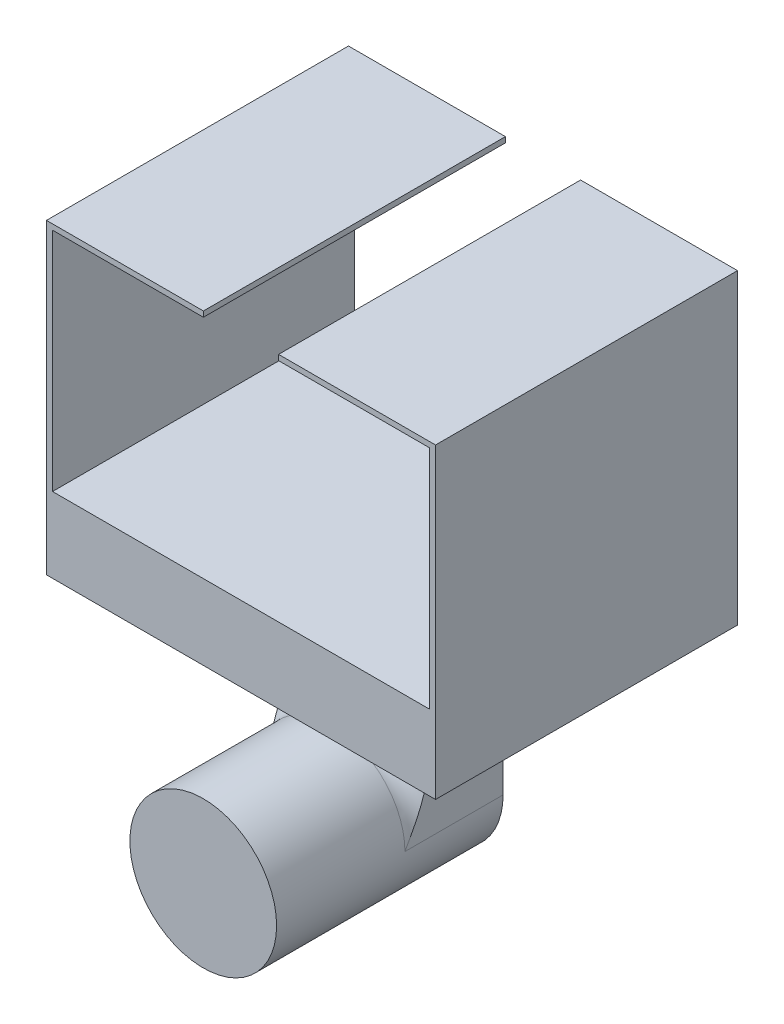
ISO-10303-21;
HEADER;
FILE_DESCRIPTION(('STEP AP214'),'2;1');
FILE_NAME('part.step','',(''),(''),'','','');
FILE_SCHEMA(('AUTOMOTIVE_DESIGN { 1 0 10303 214 1 1 1 1 }'));
ENDSEC;
DATA;
#1=APPLICATION_CONTEXT('core data for automotive mechanical design processes');
#2=APPLICATION_PROTOCOL_DEFINITION('international standard','automotive_design',2000,#1);
#3=PRODUCT_CONTEXT('',#1,'mechanical');
#4=PRODUCT('Part','Part','',(#3));
#5=PRODUCT_RELATED_PRODUCT_CATEGORY('part','',(#4));
#6=PRODUCT_DEFINITION_FORMATION('','',#4);
#7=PRODUCT_DEFINITION_CONTEXT('part definition',#1,'design');
#8=PRODUCT_DEFINITION('design','',#6,#7);
#9=PRODUCT_DEFINITION_SHAPE('','',#8);
#10=(LENGTH_UNIT() NAMED_UNIT(*) SI_UNIT(.MILLI.,.METRE.));
#11=(NAMED_UNIT(*) PLANE_ANGLE_UNIT() SI_UNIT($,.RADIAN.));
#12=(NAMED_UNIT(*) SI_UNIT($,.STERADIAN.) SOLID_ANGLE_UNIT());
#13=UNCERTAINTY_MEASURE_WITH_UNIT(LENGTH_MEASURE(1.E-05),#10,'distance_accuracy_value','');
#14=(GEOMETRIC_REPRESENTATION_CONTEXT(3) GLOBAL_UNCERTAINTY_ASSIGNED_CONTEXT((#13)) GLOBAL_UNIT_ASSIGNED_CONTEXT((#10,
#11,#12)) REPRESENTATION_CONTEXT('',''));
#15=CARTESIAN_POINT('',(0.,0.,0.));
#16=DIRECTION('',(0.,0.,1.));
#17=DIRECTION('',(1.,0.,0.));
#18=AXIS2_PLACEMENT_3D('',#15,#16,#17);
#19=CARTESIAN_POINT('',(-32.7209577851901,77.0394201761409,-6.35));
#20=DIRECTION('',(0.,0.,-1.));
#21=DIRECTION('',(-1.,0.,0.));
#22=AXIS2_PLACEMENT_3D('',#19,#20,#21);
#23=PLANE('',#22);
#24=DIRECTION('',(0.,-1.,0.));
#25=VECTOR('',#24,1.);
#26=CARTESIAN_POINT('',(-6.3246,76.1238,-6.35000000000001));
#27=LINE('',#26,#25);
#28=CARTESIAN_POINT('',(-6.3246,77.0394201761409,-6.35000000000001));
#29=VERTEX_POINT('',#28);
#30=CARTESIAN_POINT('',(-6.3246,76.1238,-6.35000000000001));
#31=VERTEX_POINT('',#30);
#32=EDGE_CURVE('E177',#29,#31,#27,.T.);
#33=ORIENTED_EDGE('',*,*,#32,.F.);
#34=DIRECTION('',(1.,0.,0.));
#35=VECTOR('',#34,1.);
#36=CARTESIAN_POINT('',(-32.7209577851901,77.0394201761409,-6.35));
#37=LINE('',#36,#35);
#38=CARTESIAN_POINT('',(-32.7209577851901,77.0394201761409,-6.35));
#39=VERTEX_POINT('',#38);
#40=EDGE_CURVE('E238',#39,#29,#37,.T.);
#41=ORIENTED_EDGE('',*,*,#40,.F.);
#42=DIRECTION('',(0.,-1.,0.));
#43=VECTOR('',#42,1.);
#44=CARTESIAN_POINT('',(-32.7209577851901,77.0394201761409,-6.35));
#45=LINE('',#44,#43);
#46=CARTESIAN_POINT('',(-32.7209577851901,25.4,-6.35));
#47=VERTEX_POINT('',#46);
#48=EDGE_CURVE('E262',#39,#47,#45,.T.);
#49=ORIENTED_EDGE('',*,*,#48,.T.);
#50=DIRECTION('',(1.,0.,0.));
#51=VECTOR('',#50,1.);
#52=CARTESIAN_POINT('',(-32.7209577851901,25.4,-6.35));
#53=LINE('',#52,#51);
#54=CARTESIAN_POINT('',(32.7209577851901,25.4,-6.35000000000002));
#55=VERTEX_POINT('',#54);
#56=EDGE_CURVE('E248',#47,#55,#53,.T.);
#57=ORIENTED_EDGE('',*,*,#56,.T.);
#58=DIRECTION('',(0.,-1.,0.));
#59=VECTOR('',#58,1.);
#60=CARTESIAN_POINT('',(32.7209577851901,77.0394201761409,-6.35000000000002));
#61=LINE('',#60,#59);
#62=CARTESIAN_POINT('',(32.7209577851901,77.0394201761409,-6.35000000000002));
#63=VERTEX_POINT('',#62);
#64=EDGE_CURVE('E259',#63,#55,#61,.T.);
#65=ORIENTED_EDGE('',*,*,#64,.F.);
#66=CARTESIAN_POINT('',(6.3246,77.0394201761409,-6.35000000000001));
#67=VERTEX_POINT('',#66);
#68=EDGE_CURVE('E236',#67,#63,#37,.T.);
#69=ORIENTED_EDGE('',*,*,#68,.F.);
#70=DIRECTION('',(0.,1.,0.));
#71=VECTOR('',#70,1.);
#72=CARTESIAN_POINT('',(6.3246,76.1238,-6.35000000000001));
#73=LINE('',#72,#71);
#74=CARTESIAN_POINT('',(6.3246,76.1238,-6.35000000000001));
#75=VERTEX_POINT('',#74);
#76=EDGE_CURVE('E194',#75,#67,#73,.T.);
#77=ORIENTED_EDGE('',*,*,#76,.F.);
#78=DIRECTION('',(-1.,0.,0.));
#79=VECTOR('',#78,1.);
#80=CARTESIAN_POINT('',(-31.70428,76.1238,-6.35000000000001));
#81=LINE('',#80,#79);
#82=CARTESIAN_POINT('',(31.70428,76.1238,-6.35000000000001));
#83=VERTEX_POINT('',#82);
#84=EDGE_CURVE('E221',#83,#75,#81,.T.);
#85=ORIENTED_EDGE('',*,*,#84,.F.);
#86=DIRECTION('',(0.,1.,0.));
#87=VECTOR('',#86,1.);
#88=CARTESIAN_POINT('',(31.70428,38.0492,-6.35000000000001));
#89=LINE('',#88,#87);
#90=CARTESIAN_POINT('',(31.70428,38.0492,-6.35000000000001));
#91=VERTEX_POINT('',#90);
#92=EDGE_CURVE('E212',#91,#83,#89,.T.);
#93=ORIENTED_EDGE('',*,*,#92,.F.);
#94=DIRECTION('',(1.,0.,0.));
#95=VECTOR('',#94,1.);
#96=CARTESIAN_POINT('',(-31.70428,38.0492,-6.35000000000001));
#97=LINE('',#96,#95);
#98=CARTESIAN_POINT('',(-31.70428,38.0492,-6.35));
#99=VERTEX_POINT('',#98);
#100=EDGE_CURVE('E215',#99,#91,#97,.T.);
#101=ORIENTED_EDGE('',*,*,#100,.F.);
#102=DIRECTION('',(0.,-1.,0.));
#103=VECTOR('',#102,1.);
#104=CARTESIAN_POINT('',(-31.70428,38.0492,-6.35000000000001));
#105=LINE('',#104,#103);
#106=CARTESIAN_POINT('',(-31.70428,76.1238,-6.35000000000001));
#107=VERTEX_POINT('',#106);
#108=EDGE_CURVE('E208',#107,#99,#105,.T.);
#109=ORIENTED_EDGE('',*,*,#108,.F.);
#110=EDGE_CURVE('E220',#31,#107,#81,.T.);
#111=ORIENTED_EDGE('',*,*,#110,.F.);
#112=EDGE_LOOP('',(#33,#41,#49,#57,#65,#69,#77,#85,#93,#101,#109,#111));
#113=FACE_BOUND('',#112,.T.);
#114=ADVANCED_FACE('F47',(#113),#23,.F.);
#115=CARTESIAN_POINT('',(0.,77.0394201761409,0.));
#116=DIRECTION('',(0.,1.,0.));
#117=DIRECTION('',(0.,0.,1.));
#118=AXIS2_PLACEMENT_3D('',#115,#116,#117);
#119=PLANE('',#118);
#120=DIRECTION('',(-1.,0.,0.));
#121=VECTOR('',#120,1.);
#122=CARTESIAN_POINT('',(-32.7209577851901,77.0394201761409,-57.15));
#123=LINE('',#122,#121);
#124=CARTESIAN_POINT('',(32.7209577851901,77.0394201761409,-57.15));
#125=VERTEX_POINT('',#124);
#126=CARTESIAN_POINT('',(6.3246,77.0394201761409,-57.15));
#127=VERTEX_POINT('',#126);
#128=EDGE_CURVE('E243',#125,#127,#123,.T.);
#129=ORIENTED_EDGE('',*,*,#128,.T.);
#130=DIRECTION('',(0.,0.,1.));
#131=VECTOR('',#130,1.);
#132=CARTESIAN_POINT('',(6.3246,77.0394201761409,-57.15));
#133=LINE('',#132,#131);
#134=EDGE_CURVE('E398',#127,#67,#133,.T.);
#135=ORIENTED_EDGE('',*,*,#134,.T.);
#136=ORIENTED_EDGE('',*,*,#68,.T.);
#137=DIRECTION('',(0.,0.,-1.));
#138=VECTOR('',#137,1.);
#139=CARTESIAN_POINT('',(32.7209577851901,77.0394201761409,-57.15));
#140=LINE('',#139,#138);
#141=EDGE_CURVE('E241',#63,#125,#140,.T.);
#142=ORIENTED_EDGE('',*,*,#141,.T.);
#143=EDGE_LOOP('',(#129,#135,#136,#142));
#144=FACE_BOUND('',#143,.T.);
#145=ADVANCED_FACE('F344',(#144),#119,.T.);
#146=CARTESIAN_POINT('',(-31.70428,76.1238,-57.15));
#147=DIRECTION('',(0.,1.,0.));
#148=DIRECTION('',(-1.,0.,0.));
#149=AXIS2_PLACEMENT_3D('',#146,#147,#148);
#150=PLANE('',#149);
#151=DIRECTION('',(0.,0.,1.));
#152=VECTOR('',#151,1.);
#153=CARTESIAN_POINT('',(6.3246,76.1238,-57.15));
#154=LINE('',#153,#152);
#155=CARTESIAN_POINT('',(6.3246,76.1238,-57.15));
#156=VERTEX_POINT('',#155);
#157=EDGE_CURVE('E182',#156,#75,#154,.T.);
#158=ORIENTED_EDGE('',*,*,#157,.F.);
#159=DIRECTION('',(-1.,0.,0.));
#160=VECTOR('',#159,1.);
#161=CARTESIAN_POINT('',(-31.70428,76.1238,-57.15));
#162=LINE('',#161,#160);
#163=CARTESIAN_POINT('',(31.70428,76.1238,-57.15));
#164=VERTEX_POINT('',#163);
#165=EDGE_CURVE('E200',#164,#156,#162,.T.);
#166=ORIENTED_EDGE('',*,*,#165,.F.);
#167=DIRECTION('',(0.,0.,1.));
#168=VECTOR('',#167,1.);
#169=CARTESIAN_POINT('',(31.70428,76.1238,-57.15));
#170=LINE('',#169,#168);
#171=EDGE_CURVE('E227',#164,#83,#170,.T.);
#172=ORIENTED_EDGE('',*,*,#171,.T.);
#173=ORIENTED_EDGE('',*,*,#84,.T.);
#174=EDGE_LOOP('',(#158,#166,#172,#173));
#175=FACE_BOUND('',#174,.T.);
#176=ADVANCED_FACE('F326',(#175),#150,.F.);
#177=CARTESIAN_POINT('',(0.,0.,-38.1));
#178=DIRECTION('',(0.,0.,1.));
#179=DIRECTION('',(1.,0.,0.));
#180=AXIS2_PLACEMENT_3D('',#177,#178,#179);
#181=CYLINDRICAL_SURFACE('',#180,12.3372375200668);
#182=CARTESIAN_POINT('',(0.,0.,-21.59));
#183=DIRECTION('',(0.,0.,-1.));
#184=DIRECTION('',(-1.,0.,0.));
#185=AXIS2_PLACEMENT_3D('',#182,#183,#184);
#186=CIRCLE('',#185,12.3372375200668);
#187=CARTESIAN_POINT('',(12.3372375200668,0.,-21.59));
#188=VERTEX_POINT('',#187);
#189=CARTESIAN_POINT('',(-12.3372375200668,0.,-21.59));
#190=VERTEX_POINT('',#189);
#191=EDGE_CURVE('E293',#188,#190,#186,.F.);
#192=ORIENTED_EDGE('',*,*,#191,.T.);
#193=DIRECTION('',(0.,0.,-1.));
#194=VECTOR('',#193,1.);
#195=CARTESIAN_POINT('',(-12.3372375200668,0.,-25.4));
#196=LINE('',#195,#194);
#197=CARTESIAN_POINT('',(-12.3372375200668,0.,-38.1));
#198=VERTEX_POINT('',#197);
#199=EDGE_CURVE('E283',#190,#198,#196,.T.);
#200=ORIENTED_EDGE('',*,*,#199,.T.);
#201=CARTESIAN_POINT('',(0.,0.,-38.1));
#202=DIRECTION('',(0.,0.,1.));
#203=DIRECTION('',(1.,0.,0.));
#204=AXIS2_PLACEMENT_3D('',#201,#202,#203);
#205=CIRCLE('',#204,12.3372375200668);
#206=CARTESIAN_POINT('',(12.3372375200668,0.,-38.1));
#207=VERTEX_POINT('',#206);
#208=EDGE_CURVE('E288',#198,#207,#205,.T.);
#209=ORIENTED_EDGE('',*,*,#208,.T.);
#210=DIRECTION('',(0.,0.,-1.));
#211=VECTOR('',#210,1.);
#212=CARTESIAN_POINT('',(12.3372375200668,0.,-25.4));
#213=LINE('',#212,#211);
#214=EDGE_CURVE('E272',#188,#207,#213,.T.);
#215=ORIENTED_EDGE('',*,*,#214,.F.);
#216=EDGE_LOOP('',(#192,#200,#209,#215));
#217=FACE_BOUND('',#216,.T.);
#218=CARTESIAN_POINT('',(0.,0.,0.));
#219=DIRECTION('',(0.,0.,1.));
#220=DIRECTION('',(1.,0.,0.));
#221=AXIS2_PLACEMENT_3D('',#218,#219,#220);
#222=CIRCLE('',#221,12.3372375200668);
#223=CARTESIAN_POINT('',(12.3372375200668,0.,0.));
#224=VERTEX_POINT('',#223);
#225=EDGE_CURVE('E281',#224,#224,#222,.T.);
#226=ORIENTED_EDGE('',*,*,#225,.F.);
#227=EDGE_LOOP('',(#226));
#228=FACE_BOUND('',#227,.T.);
#229=ADVANCED_FACE('F323',(#217,#228),#181,.T.);
#230=CARTESIAN_POINT('',(0.,0.,-38.1));
#231=DIRECTION('',(0.,0.,1.));
#232=DIRECTION('',(1.,0.,0.));
#233=AXIS2_PLACEMENT_3D('',#230,#231,#232);
#234=PLANE('',#233);
#235=ORIENTED_EDGE('',*,*,#208,.F.);
#236=DIRECTION('',(0.,1.,0.));
#237=VECTOR('',#236,1.);
#238=CARTESIAN_POINT('',(-12.3372375200668,0.,-38.1));
#239=LINE('',#238,#237);
#240=CARTESIAN_POINT('',(-12.3372375200668,25.4,-38.1));
#241=VERTEX_POINT('',#240);
#242=EDGE_CURVE('E274',#198,#241,#239,.T.);
#243=ORIENTED_EDGE('',*,*,#242,.T.);
#244=DIRECTION('',(1.,0.,0.));
#245=VECTOR('',#244,1.);
#246=CARTESIAN_POINT('',(-12.3372375200668,25.4,-38.1));
#247=LINE('',#246,#245);
#248=CARTESIAN_POINT('',(12.3372375200668,25.4,-38.1));
#249=VERTEX_POINT('',#248);
#250=EDGE_CURVE('E267',#241,#249,#247,.T.);
#251=ORIENTED_EDGE('',*,*,#250,.T.);
#252=DIRECTION('',(0.,-1.,0.));
#253=VECTOR('',#252,1.);
#254=CARTESIAN_POINT('',(12.3372375200668,0.,-38.1));
#255=LINE('',#254,#253);
#256=EDGE_CURVE('E265',#249,#207,#255,.T.);
#257=ORIENTED_EDGE('',*,*,#256,.T.);
#258=EDGE_LOOP('',(#235,#243,#251,#257));
#259=FACE_BOUND('',#258,.T.);
#260=ADVANCED_FACE('F322',(#259),#234,.F.);
#261=CARTESIAN_POINT('',(0.,0.,0.));
#262=DIRECTION('',(0.,0.,1.));
#263=DIRECTION('',(1.,0.,0.));
#264=AXIS2_PLACEMENT_3D('',#261,#262,#263);
#265=PLANE('',#264);
#266=ORIENTED_EDGE('',*,*,#225,.T.);
#267=EDGE_LOOP('',(#266));
#268=FACE_BOUND('',#267,.T.);
#269=ADVANCED_FACE('F329',(#268),#265,.T.);
#270=CARTESIAN_POINT('',(12.3372375200668,0.,-25.4));
#271=DIRECTION('',(1.,0.,0.));
#272=DIRECTION('',(0.,0.,-1.));
#273=AXIS2_PLACEMENT_3D('',#270,#271,#272);
#274=PLANE('',#273);
#275=ORIENTED_EDGE('',*,*,#256,.F.);
#276=DIRECTION('',(0.,0.,-1.));
#277=VECTOR('',#276,1.);
#278=CARTESIAN_POINT('',(12.3372375200668,25.4,-25.4));
#279=LINE('',#278,#277);
#280=CARTESIAN_POINT('',(12.3372375200668,25.4,-19.05));
#281=VERTEX_POINT('',#280);
#282=EDGE_CURVE('E276',#281,#249,#279,.T.);
#283=ORIENTED_EDGE('',*,*,#282,.F.);
#284=CARTESIAN_POINT('',(12.3372375200668,19.05,-19.05));
#285=DIRECTION('',(1.,0.,0.));
#286=DIRECTION('',(0.,0.,-1.));
#287=AXIS2_PLACEMENT_3D('',#284,#285,#286);
#288=CIRCLE('',#287,6.35);
#289=CARTESIAN_POINT('',(12.3372375200668,19.05,-25.4));
#290=VERTEX_POINT('',#289);
#291=EDGE_CURVE('E60',#281,#290,#288,.F.);
#292=ORIENTED_EDGE('',*,*,#291,.T.);
#293=DIRECTION('',(0.,-1.,0.));
#294=VECTOR('',#293,1.);
#295=CARTESIAN_POINT('',(12.3372375200668,0.,-25.4));
#296=LINE('',#295,#294);
#297=CARTESIAN_POINT('',(12.3372375200668,10.417574089149,-25.4));
#298=VERTEX_POINT('',#297);
#299=EDGE_CURVE('E266',#290,#298,#296,.T.);
#300=ORIENTED_EDGE('',*,*,#299,.T.);
#301=CARTESIAN_POINT('',(12.3372375200668,10.417574089149,-25.4));
#302=CARTESIAN_POINT('',(12.3372375200668,10.2663967096296,-25.3999939720037));
#303=CARTESIAN_POINT('',(12.3372375200668,10.1152593881594,-25.3962555747034));
#304=CARTESIAN_POINT('',(12.3372375200668,9.81336703504193,-25.3818453082896));
#305=CARTESIAN_POINT('',(12.3372375200668,9.66261188389401,-25.3711759729466));
#306=CARTESIAN_POINT('',(12.3372375200668,9.21188122462073,-25.3296256570285));
#307=CARTESIAN_POINT('',(12.3372375200668,8.91276102833654,-25.2891975299258));
#308=CARTESIAN_POINT('',(12.3372375200668,8.32245292742546,-25.1873338822555));
#309=CARTESIAN_POINT('',(12.3372375200668,8.03121247941868,-25.126192605302));
#310=CARTESIAN_POINT('',(12.3372375200668,7.45296326942309,-24.9859087937124));
#311=CARTESIAN_POINT('',(12.3372375200668,7.16595713257746,-24.9067555535916));
#312=CARTESIAN_POINT('',(12.3372375200668,6.57970338173966,-24.7281026424453));
#313=CARTESIAN_POINT('',(12.3372375200668,6.28074167224576,-24.62767348071));
#314=CARTESIAN_POINT('',(12.3372375200668,5.68792340421379,-24.4126495023346));
#315=CARTESIAN_POINT('',(12.3372375200668,5.39406815056853,-24.2980511239129));
#316=CARTESIAN_POINT('',(12.3372375200668,4.51934820091732,-23.9367897533229));
#317=CARTESIAN_POINT('',(12.3372375200668,3.94567695457536,-23.6727728458556));
#318=CARTESIAN_POINT('',(12.3372375200668,2.80940951645804,-23.1145670141885));
#319=CARTESIAN_POINT('',(12.3372375200668,2.24689993109455,-22.8202073092783));
#320=CARTESIAN_POINT('',(12.3372375200668,1.12937991784581,-22.2175184058617));
#321=CARTESIAN_POINT('',(12.3372375200668,0.574370979245679,-21.9091864845177));
#322=CARTESIAN_POINT('',(12.3372375200668,0.012945162084226,-21.5971938427283));
#323=CARTESIAN_POINT('',(12.3372375200668,0.00647258022774634,-21.5935969202349));
#324=CARTESIAN_POINT('',(12.3372375200668,0.,-21.59));
#325=B_SPLINE_CURVE_WITH_KNOTS('',3,(#301,#302,#303,#304,#305,#306,#307,#308,#309,#310,#311,
#312,#313,#314,#315,#316,#317,#318,#319,#320,#321,#322,#323,#324),.UNSPECIFIED.,.F.,.F.,(4,2,2,
2,2,2,2,2,2,2,2,4),(0.,0.453420718408652,0.906675771209944,1.81115454618135,2.70328882115928,
3.59595473121387,4.54166081067764,5.48760510182128,7.38058605089352,9.28487255005866,
11.189531756757,11.2117463803371),.UNSPECIFIED.);
#326=EDGE_CURVE('E306',#298,#188,#325,.T.);
#327=ORIENTED_EDGE('',*,*,#326,.T.);
#328=ORIENTED_EDGE('',*,*,#214,.T.);
#329=EDGE_LOOP('',(#275,#283,#292,#300,#327,#328));
#330=FACE_BOUND('',#329,.T.);
#331=ADVANCED_FACE('F331',(#330),#274,.T.);
#332=CARTESIAN_POINT('',(-12.3372375200668,0.,-25.4));
#333=DIRECTION('',(-1.,0.,0.));
#334=DIRECTION('',(0.,0.,1.));
#335=AXIS2_PLACEMENT_3D('',#332,#333,#334);
#336=PLANE('',#335);
#337=ORIENTED_EDGE('',*,*,#242,.F.);
#338=ORIENTED_EDGE('',*,*,#199,.F.);
#339=CARTESIAN_POINT('',(-12.3372375200668,10.417574089149,-25.4));
#340=CARTESIAN_POINT('',(-12.3372375200668,10.2663967096296,-25.3999939720037));
#341=CARTESIAN_POINT('',(-12.3372375200668,10.1152593881594,-25.3962555747034));
#342=CARTESIAN_POINT('',(-12.3372375200668,9.81336703504193,-25.3818453082896));
#343=CARTESIAN_POINT('',(-12.3372375200668,9.66261188389401,-25.3711759729466));
#344=CARTESIAN_POINT('',(-12.3372375200668,9.21188122462073,-25.3296256570285));
#345=CARTESIAN_POINT('',(-12.3372375200668,8.91276102833654,-25.2891975299258));
#346=CARTESIAN_POINT('',(-12.3372375200668,8.32245292742546,-25.1873338822555));
#347=CARTESIAN_POINT('',(-12.3372375200668,8.03121247941868,-25.126192605302));
#348=CARTESIAN_POINT('',(-12.3372375200668,7.45296326942309,-24.9859087937124));
#349=CARTESIAN_POINT('',(-12.3372375200668,7.16595713257746,-24.9067555535916));
#350=CARTESIAN_POINT('',(-12.3372375200668,6.57970338173966,-24.7281026424453));
#351=CARTESIAN_POINT('',(-12.3372375200668,6.28074167224576,-24.62767348071));
#352=CARTESIAN_POINT('',(-12.3372375200668,5.68792340421379,-24.4126495023346));
#353=CARTESIAN_POINT('',(-12.3372375200668,5.39406815056853,-24.2980511239129));
#354=CARTESIAN_POINT('',(-12.3372375200668,4.51934820091732,-23.9367897533229));
#355=CARTESIAN_POINT('',(-12.3372375200668,3.94567695457536,-23.6727728458556));
#356=CARTESIAN_POINT('',(-12.3372375200668,2.80940951645804,-23.1145670141885));
#357=CARTESIAN_POINT('',(-12.3372375200668,2.24689993109455,-22.8202073092783));
#358=CARTESIAN_POINT('',(-12.3372375200668,1.12937991784581,-22.2175184058617));
#359=CARTESIAN_POINT('',(-12.3372375200668,0.574370979245679,-21.9091864845177));
#360=CARTESIAN_POINT('',(-12.3372375200668,0.012945162084226,-21.5971938427283));
#361=CARTESIAN_POINT('',(-12.3372375200668,0.00647258022774634,-21.5935969202349));
#362=CARTESIAN_POINT('',(-12.3372375200668,0.,-21.59));
#363=B_SPLINE_CURVE_WITH_KNOTS('',3,(#339,#340,#341,#342,#343,#344,#345,#346,#347,#348,#349,
#350,#351,#352,#353,#354,#355,#356,#357,#358,#359,#360,#361,#362),.UNSPECIFIED.,.F.,.F.,(4,2,2,
2,2,2,2,2,2,2,2,4),(0.,0.453420718408652,0.906675771209944,1.81115454618135,2.70328882115928,
3.59595473121387,4.54166081067764,5.48760510182128,7.38058605089352,9.28487255005866,
11.189531756757,11.2117463803371),.UNSPECIFIED.);
#364=CARTESIAN_POINT('',(-12.3372375200668,10.417574089149,-25.4));
#365=VERTEX_POINT('',#364);
#366=EDGE_CURVE('E299',#190,#365,#363,.F.);
#367=ORIENTED_EDGE('',*,*,#366,.T.);
#368=DIRECTION('',(0.,1.,0.));
#369=VECTOR('',#368,1.);
#370=CARTESIAN_POINT('',(-12.3372375200668,0.,-25.4));
#371=LINE('',#370,#369);
#372=CARTESIAN_POINT('',(-12.3372375200668,19.05,-25.4));
#373=VERTEX_POINT('',#372);
#374=EDGE_CURVE('E268',#365,#373,#371,.T.);
#375=ORIENTED_EDGE('',*,*,#374,.T.);
#376=CARTESIAN_POINT('',(-12.3372375200668,19.05,-19.05));
#377=DIRECTION('',(-1.,0.,0.));
#378=DIRECTION('',(0.,0.,1.));
#379=AXIS2_PLACEMENT_3D('',#376,#377,#378);
#380=CIRCLE('',#379,6.35);
#381=CARTESIAN_POINT('',(-12.3372375200668,25.4,-19.05));
#382=VERTEX_POINT('',#381);
#383=EDGE_CURVE('E12',#373,#382,#380,.F.);
#384=ORIENTED_EDGE('',*,*,#383,.T.);
#385=DIRECTION('',(0.,0.,-1.));
#386=VECTOR('',#385,1.);
#387=CARTESIAN_POINT('',(-12.3372375200668,25.4,-25.4));
#388=LINE('',#387,#386);
#389=EDGE_CURVE('E282',#382,#241,#388,.T.);
#390=ORIENTED_EDGE('',*,*,#389,.T.);
#391=EDGE_LOOP('',(#337,#338,#367,#375,#384,#390));
#392=FACE_BOUND('',#391,.T.);
#393=ADVANCED_FACE('F312',(#392),#336,.T.);
#394=CARTESIAN_POINT('',(0.,0.,-25.4));
#395=DIRECTION('',(0.,0.,-1.));
#396=DIRECTION('',(-1.,0.,0.));
#397=AXIS2_PLACEMENT_3D('',#394,#395,#396);
#398=PLANE('',#397);
#399=ORIENTED_EDGE('',*,*,#299,.F.);
#400=DIRECTION('',(1.,0.,0.));
#401=VECTOR('',#400,1.);
#402=CARTESIAN_POINT('',(-12.3372375200668,19.05,-25.4));
#403=LINE('',#402,#401);
#404=EDGE_CURVE('E70',#290,#373,#403,.F.);
#405=ORIENTED_EDGE('',*,*,#404,.T.);
#406=ORIENTED_EDGE('',*,*,#374,.F.);
#407=CARTESIAN_POINT('',(0.,0.,-25.4));
#408=DIRECTION('',(0.,0.,-1.));
#409=DIRECTION('',(-1.,0.,0.));
#410=AXIS2_PLACEMENT_3D('',#407,#408,#409);
#411=CIRCLE('',#410,16.1472375200668);
#412=EDGE_CURVE('E298',#365,#298,#411,.T.);
#413=ORIENTED_EDGE('',*,*,#412,.T.);
#414=EDGE_LOOP('',(#399,#405,#406,#413));
#415=FACE_BOUND('',#414,.T.);
#416=ADVANCED_FACE('F338',(#415),#398,.F.);
#417=CARTESIAN_POINT('',(-32.7209577851901,77.0394201761409,-57.15));
#418=DIRECTION('',(1.,0.,0.));
#419=DIRECTION('',(0.,0.,-1.));
#420=AXIS2_PLACEMENT_3D('',#417,#418,#419);
#421=PLANE('',#420);
#422=DIRECTION('',(0.,0.,1.));
#423=VECTOR('',#422,1.);
#424=CARTESIAN_POINT('',(-32.7209577851901,25.4,-57.15));
#425=LINE('',#424,#423);
#426=CARTESIAN_POINT('',(-32.7209577851901,25.4,-57.15));
#427=VERTEX_POINT('',#426);
#428=EDGE_CURVE('E228',#427,#47,#425,.T.);
#429=ORIENTED_EDGE('',*,*,#428,.T.);
#430=ORIENTED_EDGE('',*,*,#48,.F.);
#431=DIRECTION('',(0.,0.,1.));
#432=VECTOR('',#431,1.);
#433=CARTESIAN_POINT('',(-32.7209577851901,77.0394201761409,-57.15));
#434=LINE('',#433,#432);
#435=CARTESIAN_POINT('',(-32.7209577851901,77.0394201761409,-57.15));
#436=VERTEX_POINT('',#435);
#437=EDGE_CURVE('E231',#436,#39,#434,.T.);
#438=ORIENTED_EDGE('',*,*,#437,.F.);
#439=DIRECTION('',(0.,-1.,0.));
#440=VECTOR('',#439,1.);
#441=CARTESIAN_POINT('',(-32.7209577851901,77.0394201761409,-57.15));
#442=LINE('',#441,#440);
#443=EDGE_CURVE('E246',#436,#427,#442,.T.);
#444=ORIENTED_EDGE('',*,*,#443,.T.);
#445=EDGE_LOOP('',(#429,#430,#438,#444));
#446=FACE_BOUND('',#445,.T.);
#447=ADVANCED_FACE('F356',(#446),#421,.F.);
#448=CARTESIAN_POINT('',(32.7209577851901,77.0394201761409,-57.15));
#449=DIRECTION('',(-1.,0.,0.));
#450=DIRECTION('',(0.,0.,1.));
#451=AXIS2_PLACEMENT_3D('',#448,#449,#450);
#452=PLANE('',#451);
#453=DIRECTION('',(0.,0.,-1.));
#454=VECTOR('',#453,1.);
#455=CARTESIAN_POINT('',(32.7209577851901,25.4,-57.15));
#456=LINE('',#455,#454);
#457=CARTESIAN_POINT('',(32.7209577851901,25.4,-57.15));
#458=VERTEX_POINT('',#457);
#459=EDGE_CURVE('E252',#55,#458,#456,.T.);
#460=ORIENTED_EDGE('',*,*,#459,.T.);
#461=DIRECTION('',(0.,-1.,0.));
#462=VECTOR('',#461,1.);
#463=CARTESIAN_POINT('',(32.7209577851901,77.0394201761409,-57.15));
#464=LINE('',#463,#462);
#465=EDGE_CURVE('E258',#125,#458,#464,.T.);
#466=ORIENTED_EDGE('',*,*,#465,.F.);
#467=ORIENTED_EDGE('',*,*,#141,.F.);
#468=ORIENTED_EDGE('',*,*,#64,.T.);
#469=EDGE_LOOP('',(#460,#466,#467,#468));
#470=FACE_BOUND('',#469,.T.);
#471=ADVANCED_FACE('F358',(#470),#452,.F.);
#472=CARTESIAN_POINT('',(-32.7209577851901,77.0394201761409,-57.15));
#473=DIRECTION('',(0.,0.,1.));
#474=DIRECTION('',(1.,0.,0.));
#475=AXIS2_PLACEMENT_3D('',#472,#473,#474);
#476=PLANE('',#475);
#477=CARTESIAN_POINT('',(-6.3246,77.0394201761409,-57.15));
#478=VERTEX_POINT('',#477);
#479=EDGE_CURVE('E191',#478,#436,#123,.T.);
#480=ORIENTED_EDGE('',*,*,#479,.F.);
#481=DIRECTION('',(0.,-1.,0.));
#482=VECTOR('',#481,1.);
#483=CARTESIAN_POINT('',(-6.3246,76.1238,-57.15));
#484=LINE('',#483,#482);
#485=CARTESIAN_POINT('',(-6.3246,76.1238,-57.15));
#486=VERTEX_POINT('',#485);
#487=EDGE_CURVE('E176',#478,#486,#484,.T.);
#488=ORIENTED_EDGE('',*,*,#487,.T.);
#489=CARTESIAN_POINT('',(-31.70428,76.1238,-57.15));
#490=VERTEX_POINT('',#489);
#491=EDGE_CURVE('E188',#486,#490,#162,.T.);
#492=ORIENTED_EDGE('',*,*,#491,.T.);
#493=DIRECTION('',(0.,-1.,0.));
#494=VECTOR('',#493,1.);
#495=CARTESIAN_POINT('',(-31.70428,38.0492,-57.15));
#496=LINE('',#495,#494);
#497=CARTESIAN_POINT('',(-31.70428,38.0492,-57.15));
#498=VERTEX_POINT('',#497);
#499=EDGE_CURVE('E222',#490,#498,#496,.T.);
#500=ORIENTED_EDGE('',*,*,#499,.T.);
#501=DIRECTION('',(1.,0.,0.));
#502=VECTOR('',#501,1.);
#503=CARTESIAN_POINT('',(-31.70428,38.0492,-57.15));
#504=LINE('',#503,#502);
#505=CARTESIAN_POINT('',(31.70428,38.0492,-57.15));
#506=VERTEX_POINT('',#505);
#507=EDGE_CURVE('E207',#498,#506,#504,.T.);
#508=ORIENTED_EDGE('',*,*,#507,.T.);
#509=DIRECTION('',(0.,1.,0.));
#510=VECTOR('',#509,1.);
#511=CARTESIAN_POINT('',(31.70428,38.0492,-57.15));
#512=LINE('',#511,#510);
#513=EDGE_CURVE('E201',#506,#164,#512,.T.);
#514=ORIENTED_EDGE('',*,*,#513,.T.);
#515=ORIENTED_EDGE('',*,*,#165,.T.);
#516=DIRECTION('',(0.,1.,0.));
#517=VECTOR('',#516,1.);
#518=CARTESIAN_POINT('',(6.3246,76.1238,-57.15));
#519=LINE('',#518,#517);
#520=EDGE_CURVE('E183',#156,#127,#519,.T.);
#521=ORIENTED_EDGE('',*,*,#520,.T.);
#522=ORIENTED_EDGE('',*,*,#128,.F.);
#523=ORIENTED_EDGE('',*,*,#465,.T.);
#524=DIRECTION('',(-1.,0.,0.));
#525=VECTOR('',#524,1.);
#526=CARTESIAN_POINT('',(-32.7209577851901,25.4,-57.15));
#527=LINE('',#526,#525);
#528=EDGE_CURVE('E240',#458,#427,#527,.T.);
#529=ORIENTED_EDGE('',*,*,#528,.T.);
#530=ORIENTED_EDGE('',*,*,#443,.F.);
#531=EDGE_LOOP('',(#480,#488,#492,#500,#508,#514,#515,#521,#522,#523,#529,#530));
#532=FACE_BOUND('',#531,.T.);
#533=ADVANCED_FACE('F189',(#532),#476,.F.);
#534=DIRECTION('',(0.,0.,1.));
#535=VECTOR('',#534,1.);
#536=CARTESIAN_POINT('',(-6.3246,77.0394201761409,-57.15));
#537=LINE('',#536,#535);
#538=EDGE_CURVE('E211',#478,#29,#537,.T.);
#539=ORIENTED_EDGE('',*,*,#538,.F.);
#540=ORIENTED_EDGE('',*,*,#479,.T.);
#541=ORIENTED_EDGE('',*,*,#437,.T.);
#542=ORIENTED_EDGE('',*,*,#40,.T.);
#543=EDGE_LOOP('',(#539,#540,#541,#542));
#544=FACE_BOUND('',#543,.T.);
#545=ADVANCED_FACE('F353',(#544),#119,.T.);
#546=CARTESIAN_POINT('',(0.,25.4,0.));
#547=DIRECTION('',(0.,1.,0.));
#548=DIRECTION('',(0.,0.,1.));
#549=AXIS2_PLACEMENT_3D('',#546,#547,#548);
#550=PLANE('',#549);
#551=DIRECTION('',(1.,0.,0.));
#552=VECTOR('',#551,1.);
#553=CARTESIAN_POINT('',(12.3372375200668,25.4,-19.05));
#554=LINE('',#553,#552);
#555=EDGE_CURVE('E375',#382,#281,#554,.T.);
#556=ORIENTED_EDGE('',*,*,#555,.T.);
#557=ORIENTED_EDGE('',*,*,#282,.T.);
#558=ORIENTED_EDGE('',*,*,#250,.F.);
#559=ORIENTED_EDGE('',*,*,#389,.F.);
#560=EDGE_LOOP('',(#556,#557,#558,#559));
#561=FACE_BOUND('',#560,.T.);
#562=ORIENTED_EDGE('',*,*,#428,.F.);
#563=ORIENTED_EDGE('',*,*,#528,.F.);
#564=ORIENTED_EDGE('',*,*,#459,.F.);
#565=ORIENTED_EDGE('',*,*,#56,.F.);
#566=EDGE_LOOP('',(#562,#563,#564,#565));
#567=FACE_BOUND('',#566,.T.);
#568=ADVANCED_FACE('F379',(#561,#567),#550,.F.);
#569=CARTESIAN_POINT('',(-31.70428,38.0492,-57.15));
#570=DIRECTION('',(-1.,0.,0.));
#571=DIRECTION('',(0.,-1.,0.));
#572=AXIS2_PLACEMENT_3D('',#569,#570,#571);
#573=PLANE('',#572);
#574=ORIENTED_EDGE('',*,*,#108,.T.);
#575=DIRECTION('',(0.,0.,1.));
#576=VECTOR('',#575,1.);
#577=CARTESIAN_POINT('',(-31.70428,38.0492,-57.15));
#578=LINE('',#577,#576);
#579=EDGE_CURVE('E202',#498,#99,#578,.T.);
#580=ORIENTED_EDGE('',*,*,#579,.F.);
#581=ORIENTED_EDGE('',*,*,#499,.F.);
#582=DIRECTION('',(0.,0.,1.));
#583=VECTOR('',#582,1.);
#584=CARTESIAN_POINT('',(-31.70428,76.1238,-57.15));
#585=LINE('',#584,#583);
#586=EDGE_CURVE('E199',#490,#107,#585,.T.);
#587=ORIENTED_EDGE('',*,*,#586,.T.);
#588=EDGE_LOOP('',(#574,#580,#581,#587));
#589=FACE_BOUND('',#588,.T.);
#590=ADVANCED_FACE('F385',(#589),#573,.F.);
#591=ORIENTED_EDGE('',*,*,#491,.F.);
#592=DIRECTION('',(0.,0.,1.));
#593=VECTOR('',#592,1.);
#594=CARTESIAN_POINT('',(-6.3246,76.1238,-57.15));
#595=LINE('',#594,#593);
#596=EDGE_CURVE('E173',#486,#31,#595,.T.);
#597=ORIENTED_EDGE('',*,*,#596,.T.);
#598=ORIENTED_EDGE('',*,*,#110,.T.);
#599=ORIENTED_EDGE('',*,*,#586,.F.);
#600=EDGE_LOOP('',(#591,#597,#598,#599));
#601=FACE_BOUND('',#600,.T.);
#602=ADVANCED_FACE('F196',(#601),#150,.F.);
#603=CARTESIAN_POINT('',(31.70428,38.0492,-57.15));
#604=DIRECTION('',(1.,0.,0.));
#605=DIRECTION('',(0.,1.,0.));
#606=AXIS2_PLACEMENT_3D('',#603,#604,#605);
#607=PLANE('',#606);
#608=ORIENTED_EDGE('',*,*,#92,.T.);
#609=ORIENTED_EDGE('',*,*,#171,.F.);
#610=ORIENTED_EDGE('',*,*,#513,.F.);
#611=DIRECTION('',(0.,0.,1.));
#612=VECTOR('',#611,1.);
#613=CARTESIAN_POINT('',(31.70428,38.0492,-57.15));
#614=LINE('',#613,#612);
#615=EDGE_CURVE('E230',#506,#91,#614,.T.);
#616=ORIENTED_EDGE('',*,*,#615,.T.);
#617=EDGE_LOOP('',(#608,#609,#610,#616));
#618=FACE_BOUND('',#617,.T.);
#619=ADVANCED_FACE('F413',(#618),#607,.F.);
#620=CARTESIAN_POINT('',(-31.70428,38.0492,-57.15));
#621=DIRECTION('',(0.,-1.,0.));
#622=DIRECTION('',(1.,0.,0.));
#623=AXIS2_PLACEMENT_3D('',#620,#621,#622);
#624=PLANE('',#623);
#625=ORIENTED_EDGE('',*,*,#100,.T.);
#626=ORIENTED_EDGE('',*,*,#615,.F.);
#627=ORIENTED_EDGE('',*,*,#507,.F.);
#628=ORIENTED_EDGE('',*,*,#579,.T.);
#629=EDGE_LOOP('',(#625,#626,#627,#628));
#630=FACE_BOUND('',#629,.T.);
#631=ADVANCED_FACE('F407',(#630),#624,.F.);
#632=CARTESIAN_POINT('',(6.3246,76.1238,-57.15));
#633=DIRECTION('',(1.,0.,0.));
#634=DIRECTION('',(0.,0.,-1.));
#635=AXIS2_PLACEMENT_3D('',#632,#633,#634);
#636=PLANE('',#635);
#637=ORIENTED_EDGE('',*,*,#76,.T.);
#638=ORIENTED_EDGE('',*,*,#134,.F.);
#639=ORIENTED_EDGE('',*,*,#520,.F.);
#640=ORIENTED_EDGE('',*,*,#157,.T.);
#641=EDGE_LOOP('',(#637,#638,#639,#640));
#642=FACE_BOUND('',#641,.T.);
#643=ADVANCED_FACE('F423',(#642),#636,.F.);
#644=CARTESIAN_POINT('',(-6.3246,76.1238,-57.15));
#645=DIRECTION('',(-1.,0.,0.));
#646=DIRECTION('',(0.,0.,1.));
#647=AXIS2_PLACEMENT_3D('',#644,#645,#646);
#648=PLANE('',#647);
#649=ORIENTED_EDGE('',*,*,#32,.T.);
#650=ORIENTED_EDGE('',*,*,#596,.F.);
#651=ORIENTED_EDGE('',*,*,#487,.F.);
#652=ORIENTED_EDGE('',*,*,#538,.T.);
#653=EDGE_LOOP('',(#649,#650,#651,#652));
#654=FACE_BOUND('',#653,.T.);
#655=ADVANCED_FACE('F174',(#654),#648,.F.);
#656=CARTESIAN_POINT('',(0.,0.,-21.59));
#657=DIRECTION('',(0.,0.,-1.));
#658=DIRECTION('',(-1.,0.,0.));
#659=AXIS2_PLACEMENT_3D('',#656,#657,#658);
#660=TOROIDAL_SURFACE('',#659,16.1472375200668,3.81);
#661=ORIENTED_EDGE('',*,*,#326,.F.);
#662=ORIENTED_EDGE('',*,*,#412,.F.);
#663=ORIENTED_EDGE('',*,*,#366,.F.);
#664=ORIENTED_EDGE('',*,*,#191,.F.);
#665=EDGE_LOOP('',(#661,#662,#663,#664));
#666=FACE_BOUND('',#665,.T.);
#667=ADVANCED_FACE('F317',(#666),#660,.F.);
#668=CARTESIAN_POINT('',(0.,19.05,-19.05));
#669=DIRECTION('',(-1.,0.,0.));
#670=DIRECTION('',(0.,0.,1.));
#671=AXIS2_PLACEMENT_3D('',#668,#669,#670);
#672=CYLINDRICAL_SURFACE('',#671,6.35);
#673=ORIENTED_EDGE('',*,*,#383,.F.);
#674=ORIENTED_EDGE('',*,*,#404,.F.);
#675=ORIENTED_EDGE('',*,*,#291,.F.);
#676=ORIENTED_EDGE('',*,*,#555,.F.);
#677=EDGE_LOOP('',(#673,#674,#675,#676));
#678=FACE_BOUND('',#677,.T.);
#679=ADVANCED_FACE('F51',(#678),#672,.F.);
#680=CLOSED_SHELL('',(#114,#145,#176,#229,#260,#269,#331,#393,#416,#447,#471,#533,#545,#568,
#590,#602,#619,#631,#643,#655,#667,#679));
#681=MANIFOLD_SOLID_BREP('B2',#680);
#682=ADVANCED_BREP_SHAPE_REPRESENTATION('',(#18,#681),#14);
#683=SHAPE_DEFINITION_REPRESENTATION(#9,#682);
ENDSEC;
END-ISO-10303-21;
